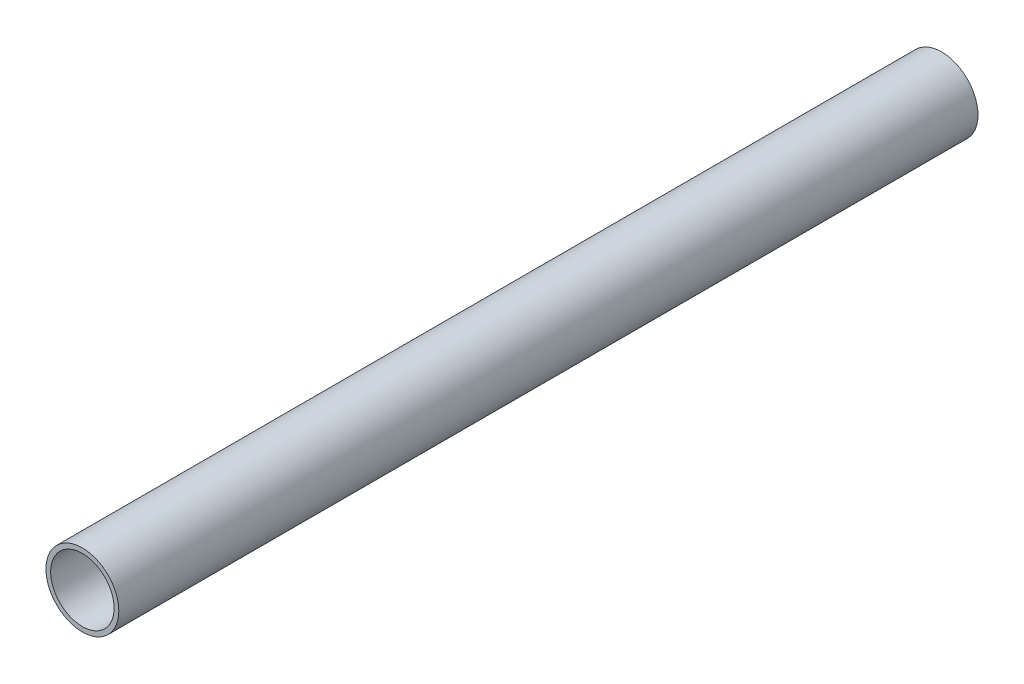
ISO-10303-21;
HEADER;
FILE_DESCRIPTION(('STEP AP214'),'2;1');
FILE_NAME('part.step','',(''),(''),'','','');
FILE_SCHEMA(('AUTOMOTIVE_DESIGN { 1 0 10303 214 1 1 1 1 }'));
ENDSEC;
DATA;
#1=APPLICATION_CONTEXT('core data for automotive mechanical design processes');
#2=APPLICATION_PROTOCOL_DEFINITION('international standard','automotive_design',2000,#1);
#3=PRODUCT_CONTEXT('',#1,'mechanical');
#4=PRODUCT('Part','Part','',(#3));
#5=PRODUCT_RELATED_PRODUCT_CATEGORY('part','',(#4));
#6=PRODUCT_DEFINITION_FORMATION('','',#4);
#7=PRODUCT_DEFINITION_CONTEXT('part definition',#1,'design');
#8=PRODUCT_DEFINITION('design','',#6,#7);
#9=PRODUCT_DEFINITION_SHAPE('','',#8);
#10=(LENGTH_UNIT() NAMED_UNIT(*) SI_UNIT(.MILLI.,.METRE.));
#11=(NAMED_UNIT(*) PLANE_ANGLE_UNIT() SI_UNIT($,.RADIAN.));
#12=(NAMED_UNIT(*) SI_UNIT($,.STERADIAN.) SOLID_ANGLE_UNIT());
#13=UNCERTAINTY_MEASURE_WITH_UNIT(LENGTH_MEASURE(1.E-05),#10,'distance_accuracy_value','');
#14=(GEOMETRIC_REPRESENTATION_CONTEXT(3) GLOBAL_UNCERTAINTY_ASSIGNED_CONTEXT((#13)) GLOBAL_UNIT_ASSIGNED_CONTEXT((#10,
#11,#12)) REPRESENTATION_CONTEXT('',''));
#15=CARTESIAN_POINT('',(0.,0.,0.));
#16=DIRECTION('',(0.,0.,1.));
#17=DIRECTION('',(1.,0.,0.));
#18=AXIS2_PLACEMENT_3D('',#15,#16,#17);
#19=CARTESIAN_POINT('',(0.,0.,711.2));
#20=DIRECTION('',(0.,0.,1.));
#21=DIRECTION('',(1.,0.,0.));
#22=AXIS2_PLACEMENT_3D('',#19,#20,#21);
#23=PLANE('',#22);
#24=CARTESIAN_POINT('',(0.,0.,711.2));
#25=DIRECTION('',(0.,0.,1.));
#26=DIRECTION('',(1.,0.,0.));
#27=AXIS2_PLACEMENT_3D('',#24,#25,#26);
#28=CIRCLE('',#27,30.1625);
#29=CARTESIAN_POINT('',(30.1625,0.,711.2));
#30=VERTEX_POINT('',#29);
#31=EDGE_CURVE('E10',#30,#30,#28,.T.);
#32=ORIENTED_EDGE('',*,*,#31,.T.);
#33=EDGE_LOOP('',(#32));
#34=FACE_BOUND('',#33,.T.);
#35=CARTESIAN_POINT('',(0.,0.,711.2));
#36=DIRECTION('',(0.,0.,1.));
#37=DIRECTION('',(1.,0.,0.));
#38=AXIS2_PLACEMENT_3D('',#35,#36,#37);
#39=CIRCLE('',#38,26.2509);
#40=CARTESIAN_POINT('',(26.2509,0.,711.2));
#41=VERTEX_POINT('',#40);
#42=EDGE_CURVE('E54',#41,#41,#39,.T.);
#43=ORIENTED_EDGE('',*,*,#42,.F.);
#44=EDGE_LOOP('',(#43));
#45=FACE_BOUND('',#44,.T.);
#46=ADVANCED_FACE('F41',(#34,#45),#23,.T.);
#47=CARTESIAN_POINT('',(0.,0.,0.));
#48=DIRECTION('',(0.,0.,1.));
#49=DIRECTION('',(1.,0.,0.));
#50=AXIS2_PLACEMENT_3D('',#47,#48,#49);
#51=PLANE('',#50);
#52=CARTESIAN_POINT('',(0.,0.,0.));
#53=DIRECTION('',(0.,0.,1.));
#54=DIRECTION('',(1.,0.,0.));
#55=AXIS2_PLACEMENT_3D('',#52,#53,#54);
#56=CIRCLE('',#55,30.1625);
#57=CARTESIAN_POINT('',(30.1625,0.,0.));
#58=VERTEX_POINT('',#57);
#59=EDGE_CURVE('E45',#58,#58,#56,.T.);
#60=ORIENTED_EDGE('',*,*,#59,.F.);
#61=EDGE_LOOP('',(#60));
#62=FACE_BOUND('',#61,.T.);
#63=CARTESIAN_POINT('',(0.,0.,0.));
#64=DIRECTION('',(0.,0.,1.));
#65=DIRECTION('',(1.,0.,0.));
#66=AXIS2_PLACEMENT_3D('',#63,#64,#65);
#67=CIRCLE('',#66,26.2509);
#68=CARTESIAN_POINT('',(26.2509,0.,0.));
#69=VERTEX_POINT('',#68);
#70=EDGE_CURVE('E56',#69,#69,#67,.T.);
#71=ORIENTED_EDGE('',*,*,#70,.T.);
#72=EDGE_LOOP('',(#71));
#73=FACE_BOUND('',#72,.T.);
#74=ADVANCED_FACE('F68',(#62,#73),#51,.F.);
#75=CARTESIAN_POINT('',(0.,0.,711.2));
#76=DIRECTION('',(0.,0.,-1.));
#77=DIRECTION('',(-1.,0.,0.));
#78=AXIS2_PLACEMENT_3D('',#75,#76,#77);
#79=CYLINDRICAL_SURFACE('',#78,30.1625);
#80=ORIENTED_EDGE('',*,*,#31,.F.);
#81=EDGE_LOOP('',(#80));
#82=FACE_BOUND('',#81,.T.);
#83=ORIENTED_EDGE('',*,*,#59,.T.);
#84=EDGE_LOOP('',(#83));
#85=FACE_BOUND('',#84,.T.);
#86=ADVANCED_FACE('F43',(#82,#85),#79,.T.);
#87=CARTESIAN_POINT('',(0.,0.,711.2));
#88=DIRECTION('',(0.,0.,-1.));
#89=DIRECTION('',(-1.,0.,0.));
#90=AXIS2_PLACEMENT_3D('',#87,#88,#89);
#91=CYLINDRICAL_SURFACE('',#90,26.2509);
#92=ORIENTED_EDGE('',*,*,#42,.T.);
#93=EDGE_LOOP('',(#92));
#94=FACE_BOUND('',#93,.T.);
#95=ORIENTED_EDGE('',*,*,#70,.F.);
#96=EDGE_LOOP('',(#95));
#97=FACE_BOUND('',#96,.T.);
#98=ADVANCED_FACE('F64',(#94,#97),#91,.F.);
#99=CLOSED_SHELL('',(#46,#74,#86,#98));
#100=MANIFOLD_SOLID_BREP('B2',#99);
#101=ADVANCED_BREP_SHAPE_REPRESENTATION('',(#18,#100),#14);
#102=SHAPE_DEFINITION_REPRESENTATION(#9,#101);
ENDSEC;
END-ISO-10303-21;
